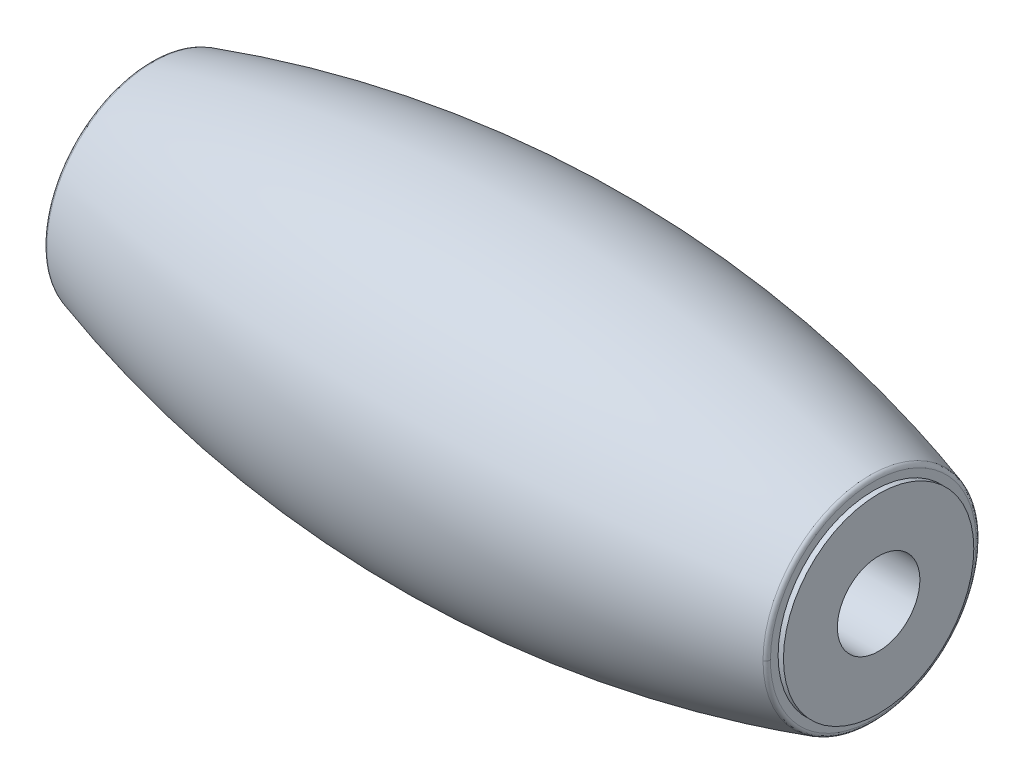
ISO-10303-21;
HEADER;
FILE_DESCRIPTION(('STEP AP214'),'2;1');
FILE_NAME('part.step','',(''),(''),'','','');
FILE_SCHEMA(('AUTOMOTIVE_DESIGN { 1 0 10303 214 1 1 1 1 }'));
ENDSEC;
DATA;
#1=APPLICATION_CONTEXT('core data for automotive mechanical design processes');
#2=APPLICATION_PROTOCOL_DEFINITION('international standard','automotive_design',2000,#1);
#3=PRODUCT_CONTEXT('',#1,'mechanical');
#4=PRODUCT('Part','Part','',(#3));
#5=PRODUCT_RELATED_PRODUCT_CATEGORY('part','',(#4));
#6=PRODUCT_DEFINITION_FORMATION('','',#4);
#7=PRODUCT_DEFINITION_CONTEXT('part definition',#1,'design');
#8=PRODUCT_DEFINITION('design','',#6,#7);
#9=PRODUCT_DEFINITION_SHAPE('','',#8);
#10=(LENGTH_UNIT() NAMED_UNIT(*) SI_UNIT(.MILLI.,.METRE.));
#11=(NAMED_UNIT(*) PLANE_ANGLE_UNIT() SI_UNIT($,.RADIAN.));
#12=(NAMED_UNIT(*) SI_UNIT($,.STERADIAN.) SOLID_ANGLE_UNIT());
#13=UNCERTAINTY_MEASURE_WITH_UNIT(LENGTH_MEASURE(1.E-05),#10,'distance_accuracy_value','');
#14=(GEOMETRIC_REPRESENTATION_CONTEXT(3) GLOBAL_UNCERTAINTY_ASSIGNED_CONTEXT((#13)) GLOBAL_UNIT_ASSIGNED_CONTEXT((#10,
#11,#12)) REPRESENTATION_CONTEXT('',''));
#15=CARTESIAN_POINT('',(0.,0.,0.));
#16=DIRECTION('',(0.,0.,1.));
#17=DIRECTION('',(1.,0.,0.));
#18=AXIS2_PLACEMENT_3D('',#15,#16,#17);
#19=CARTESIAN_POINT('',(14.097,0.,0.));
#20=DIRECTION('',(1.,0.,0.));
#21=DIRECTION('',(0.,0.,-1.));
#22=AXIS2_PLACEMENT_3D('',#19,#20,#21);
#23=CYLINDRICAL_SURFACE('',#22,3.7592);
#24=CARTESIAN_POINT('',(14.478,0.,0.));
#25=DIRECTION('',(1.,0.,0.));
#26=DIRECTION('',(0.,0.,-1.));
#27=AXIS2_PLACEMENT_3D('',#24,#25,#26);
#28=CIRCLE('',#27,3.7592);
#29=CARTESIAN_POINT('',(14.478,0.,-3.7592));
#30=VERTEX_POINT('',#29);
#31=EDGE_CURVE('P0_E19',#30,#30,#28,.T.);
#32=ORIENTED_EDGE('',*,*,#31,.F.);
#33=EDGE_LOOP('',(#32));
#34=FACE_BOUND('',#33,.T.);
#35=CARTESIAN_POINT('',(14.097,0.,0.));
#36=DIRECTION('',(1.,0.,0.));
#37=DIRECTION('',(0.,0.,-1.));
#38=AXIS2_PLACEMENT_3D('',#35,#36,#37);
#39=CIRCLE('',#38,3.7592);
#40=CARTESIAN_POINT('',(14.097,0.,-3.7592));
#41=VERTEX_POINT('',#40);
#42=EDGE_CURVE('P0_E41',#41,#41,#39,.T.);
#43=ORIENTED_EDGE('',*,*,#42,.T.);
#44=EDGE_LOOP('',(#43));
#45=FACE_BOUND('',#44,.T.);
#46=ADVANCED_FACE('P0_F15',(#34,#45),#23,.T.);
#47=CARTESIAN_POINT('',(14.478,-3.8043104,3.8043104));
#48=DIRECTION('',(1.,0.,0.));
#49=DIRECTION('',(0.,0.,-1.));
#50=AXIS2_PLACEMENT_3D('',#47,#48,#49);
#51=PLANE('',#50);
#52=CARTESIAN_POINT('',(14.478,0.,0.));
#53=DIRECTION('',(-1.,0.,0.));
#54=DIRECTION('',(0.,-1.,0.));
#55=AXIS2_PLACEMENT_3D('',#52,#53,#54);
#56=CIRCLE('',#55,1.628775);
#57=CARTESIAN_POINT('',(14.478,-1.628775,0.));
#58=VERTEX_POINT('',#57);
#59=EDGE_CURVE('P0_E39',#58,#58,#56,.F.);
#60=ORIENTED_EDGE('',*,*,#59,.F.);
#61=EDGE_LOOP('',(#60));
#62=FACE_BOUND('',#61,.T.);
#63=ORIENTED_EDGE('',*,*,#31,.T.);
#64=EDGE_LOOP('',(#63));
#65=FACE_BOUND('',#64,.T.);
#66=ADVANCED_FACE('P0_F48',(#62,#65),#51,.T.);
#67=CARTESIAN_POINT('',(14.097,-3.8043104,3.8043104));
#68=DIRECTION('',(1.,0.,0.));
#69=DIRECTION('',(0.,0.,-1.));
#70=AXIS2_PLACEMENT_3D('',#67,#68,#69);
#71=PLANE('',#70);
#72=CARTESIAN_POINT('',(14.097,0.,0.));
#73=DIRECTION('',(-1.,0.,0.));
#74=DIRECTION('',(0.,0.,1.));
#75=AXIS2_PLACEMENT_3D('',#72,#73,#74);
#76=CIRCLE('',#75,3.);
#77=CARTESIAN_POINT('',(14.097,0.,3.));
#78=VERTEX_POINT('',#77);
#79=EDGE_CURVE('P0_E36',#78,#78,#76,.F.);
#80=ORIENTED_EDGE('',*,*,#79,.T.);
#81=EDGE_LOOP('',(#80));
#82=FACE_BOUND('',#81,.T.);
#83=ORIENTED_EDGE('',*,*,#42,.F.);
#84=EDGE_LOOP('',(#83));
#85=FACE_BOUND('',#84,.T.);
#86=ADVANCED_FACE('P0_F56',(#82,#85),#71,.F.);
#87=CARTESIAN_POINT('',(14.478,0.,0.));
#88=DIRECTION('',(-1.,0.,0.));
#89=DIRECTION('',(0.,-1.,0.));
#90=AXIS2_PLACEMENT_3D('',#87,#88,#89);
#91=CYLINDRICAL_SURFACE('',#90,1.628775);
#92=CARTESIAN_POINT('',(-14.478,0.,0.));
#93=DIRECTION('',(-1.,0.,0.));
#94=DIRECTION('',(0.,-1.,0.));
#95=AXIS2_PLACEMENT_3D('',#92,#93,#94);
#96=CIRCLE('',#95,1.628775);
#97=CARTESIAN_POINT('',(-14.478,-1.62877500000002,0.));
#98=VERTEX_POINT('',#97);
#99=EDGE_CURVE('P0_E33',#98,#98,#96,.T.);
#100=ORIENTED_EDGE('',*,*,#99,.T.);
#101=EDGE_LOOP('',(#100));
#102=FACE_BOUND('',#101,.T.);
#103=ORIENTED_EDGE('',*,*,#59,.T.);
#104=EDGE_LOOP('',(#103));
#105=FACE_BOUND('',#104,.T.);
#106=ADVANCED_FACE('P0_F73',(#102,#105),#91,.F.);
#107=CARTESIAN_POINT('',(14.097,0.,0.));
#108=DIRECTION('',(-1.,0.,0.));
#109=DIRECTION('',(0.,0.,1.));
#110=AXIS2_PLACEMENT_3D('',#107,#108,#109);
#111=CYLINDRICAL_SURFACE('',#110,3.);
#112=CARTESIAN_POINT('',(-14.097,0.,0.));
#113=DIRECTION('',(-1.,0.,0.));
#114=DIRECTION('',(0.,0.,1.));
#115=AXIS2_PLACEMENT_3D('',#112,#113,#114);
#116=CIRCLE('',#115,3.);
#117=CARTESIAN_POINT('',(-14.097,0.,3.));
#118=VERTEX_POINT('',#117);
#119=EDGE_CURVE('P0_E28',#118,#118,#116,.F.);
#120=ORIENTED_EDGE('',*,*,#119,.T.);
#121=EDGE_LOOP('',(#120));
#122=FACE_BOUND('',#121,.T.);
#123=ORIENTED_EDGE('',*,*,#79,.F.);
#124=EDGE_LOOP('',(#123));
#125=FACE_BOUND('',#124,.T.);
#126=ADVANCED_FACE('P0_F71',(#122,#125),#111,.T.);
#127=CARTESIAN_POINT('',(-14.478,-3.8043104,3.8043104));
#128=DIRECTION('',(1.,0.,0.));
#129=DIRECTION('',(0.,0.,-1.));
#130=AXIS2_PLACEMENT_3D('',#127,#128,#129);
#131=PLANE('',#130);
#132=ORIENTED_EDGE('',*,*,#99,.F.);
#133=EDGE_LOOP('',(#132));
#134=FACE_BOUND('',#133,.T.);
#135=CARTESIAN_POINT('',(-14.478,0.,0.));
#136=DIRECTION('',(-1.,0.,0.));
#137=DIRECTION('',(0.,0.,1.));
#138=AXIS2_PLACEMENT_3D('',#135,#136,#137);
#139=CIRCLE('',#138,3.7592);
#140=CARTESIAN_POINT('',(-14.478,0.,3.7592));
#141=VERTEX_POINT('',#140);
#142=EDGE_CURVE('P0_E23',#141,#141,#139,.T.);
#143=ORIENTED_EDGE('',*,*,#142,.T.);
#144=EDGE_LOOP('',(#143));
#145=FACE_BOUND('',#144,.T.);
#146=ADVANCED_FACE('P0_F67',(#134,#145),#131,.F.);
#147=CARTESIAN_POINT('',(-14.097,-3.8043104,-3.8043104));
#148=DIRECTION('',(-1.,0.,0.));
#149=DIRECTION('',(0.,0.,1.));
#150=AXIS2_PLACEMENT_3D('',#147,#148,#149);
#151=PLANE('',#150);
#152=ORIENTED_EDGE('',*,*,#119,.F.);
#153=EDGE_LOOP('',(#152));
#154=FACE_BOUND('',#153,.T.);
#155=CARTESIAN_POINT('',(-14.097,0.,0.));
#156=DIRECTION('',(-1.,0.,0.));
#157=DIRECTION('',(0.,0.,1.));
#158=AXIS2_PLACEMENT_3D('',#155,#156,#157);
#159=CIRCLE('',#158,3.7592);
#160=CARTESIAN_POINT('',(-14.097,0.,3.7592));
#161=VERTEX_POINT('',#160);
#162=EDGE_CURVE('P0_E10',#161,#161,#159,.F.);
#163=ORIENTED_EDGE('',*,*,#162,.T.);
#164=EDGE_LOOP('',(#163));
#165=FACE_BOUND('',#164,.T.);
#166=ADVANCED_FACE('P0_F17',(#154,#165),#151,.F.);
#167=CARTESIAN_POINT('',(-14.097,0.,0.));
#168=DIRECTION('',(-1.,0.,0.));
#169=DIRECTION('',(0.,0.,1.));
#170=AXIS2_PLACEMENT_3D('',#167,#168,#169);
#171=CYLINDRICAL_SURFACE('',#170,3.7592);
#172=ORIENTED_EDGE('',*,*,#162,.F.);
#173=EDGE_LOOP('',(#172));
#174=FACE_BOUND('',#173,.T.);
#175=ORIENTED_EDGE('',*,*,#142,.F.);
#176=EDGE_LOOP('',(#175));
#177=FACE_BOUND('',#176,.T.);
#178=ADVANCED_FACE('P0_F60',(#174,#177),#171,.T.);
#179=CLOSED_SHELL('',(#46,#66,#86,#106,#126,#146,#166,#178));
#180=MANIFOLD_SOLID_BREP('P0_B1',#179);
#181=CARTESIAN_POINT('',(0.,0.,0.));
#182=DIRECTION('',(-1.,0.,0.));
#183=DIRECTION('',(0.,0.,1.));
#184=AXIS2_PLACEMENT_3D('',#181,#182,#183);
#185=DEGENERATE_TOROIDAL_SURFACE('',#184,42.1680420999168,48.5061716777743,.F.);
#186=CARTESIAN_POINT('',(-14.142494218031,0.,0.));
#187=DIRECTION('',(-1.,0.,0.));
#188=DIRECTION('',(0.,-1.,0.));
#189=AXIS2_PLACEMENT_3D('',#186,#187,#188);
#190=CIRCLE('',#189,4.23064913259481);
#191=CARTESIAN_POINT('',(-14.1424942180233,0.,-4.23064913269611));
#192=VERTEX_POINT('',#191);
#193=CARTESIAN_POINT('',(-14.1424942180233,0.,4.23064913269611));
#194=VERTEX_POINT('',#193);
#195=EDGE_CURVE('P1_E83',#192,#194,#190,.T.);
#196=ORIENTED_EDGE('',*,*,#195,.F.);
#197=CARTESIAN_POINT('',(-14.142494218031,0.,0.));
#198=DIRECTION('',(-1.,0.,0.));
#199=DIRECTION('',(0.,-1.,0.));
#200=AXIS2_PLACEMENT_3D('',#197,#198,#199);
#201=CIRCLE('',#200,4.23064913259481);
#202=EDGE_CURVE('P1_E55',#194,#192,#201,.T.);
#203=ORIENTED_EDGE('',*,*,#202,.F.);
#204=EDGE_LOOP('',(#196,#203));
#205=FACE_BOUND('',#204,.T.);
#206=CARTESIAN_POINT('',(14.142494218031,0.,0.));
#207=DIRECTION('',(1.,0.,0.));
#208=DIRECTION('',(0.,1.,0.));
#209=AXIS2_PLACEMENT_3D('',#206,#207,#208);
#210=CIRCLE('',#209,4.23064913259481);
#211=CARTESIAN_POINT('',(14.1424942180586,0.,-4.23064913268534));
#212=VERTEX_POINT('',#211);
#213=CARTESIAN_POINT('',(14.1424942180233,0.,4.23064913269611));
#214=VERTEX_POINT('',#213);
#215=EDGE_CURVE('P1_E71',#212,#214,#210,.T.);
#216=ORIENTED_EDGE('',*,*,#215,.F.);
#217=CARTESIAN_POINT('',(14.142494218031,0.,0.));
#218=DIRECTION('',(1.,0.,0.));
#219=DIRECTION('',(0.,1.,0.));
#220=AXIS2_PLACEMENT_3D('',#217,#218,#219);
#221=CIRCLE('',#220,4.23064913259481);
#222=EDGE_CURVE('P1_E61',#214,#212,#221,.T.);
#223=ORIENTED_EDGE('',*,*,#222,.F.);
#224=EDGE_LOOP('',(#216,#223));
#225=FACE_BOUND('',#224,.T.);
#226=ADVANCED_FACE('P1_F17',(#205,#225),#185,.F.);
#227=CARTESIAN_POINT('',(-14.266376392,0.,-4.044610919));
#228=CARTESIAN_POINT('',(-14.266376392,-8.089221839,-4.044610919));
#229=CARTESIAN_POINT('',(-14.266376392,-8.089221839,4.044610919));
#230=CARTESIAN_POINT('',(-14.266376392,0.,4.044610919));
#231=CARTESIAN_POINT('',(-14.275909005,0.,-4.13961908));
#232=CARTESIAN_POINT('',(-14.275909005,-8.279238159,-4.13961908));
#233=CARTESIAN_POINT('',(-14.275909005,-8.279238159,4.13961908));
#234=CARTESIAN_POINT('',(-14.275909005,0.,4.13961908));
#235=CARTESIAN_POINT('',(-14.219079702,0.,-4.216351417));
#236=CARTESIAN_POINT('',(-14.219079702,-8.432702834,-4.216351417));
#237=CARTESIAN_POINT('',(-14.219079702,-8.432702834,4.216351417));
#238=CARTESIAN_POINT('',(-14.219079702,0.,4.216351417));
#239=CARTESIAN_POINT('',(-14.12542009,0.,-4.234933621));
#240=CARTESIAN_POINT('',(-14.12542009,-8.469867243,-4.234933621));
#241=CARTESIAN_POINT('',(-14.12542009,-8.469867243,4.234933621));
#242=CARTESIAN_POINT('',(-14.12542009,0.,4.234933621));
#243=(BOUNDED_SURFACE() B_SPLINE_SURFACE(3,3,((#227,#228,#229,#230),(#231,#232,#233,#234),(#235,
#236,#237,#238),(#239,#240,#241,#242)),.UNSPECIFIED.,.F.,.F.,
.F.) B_SPLINE_SURFACE_WITH_KNOTS((4,4),(4,4),(0.,1.),(0.,1.),
.UNSPECIFIED.) GEOMETRIC_REPRESENTATION_ITEM() RATIONAL_B_SPLINE_SURFACE(((1.,0.333333333333333,
0.333333333333333,1.),(0.826781811919909,0.275593937306636,0.275593937306636,0.826781811919909),
(0.826781811919909,0.275593937306636,0.275593937306636,0.826781811919909),(1.,0.333333333333333,
0.333333333333333,1.))) REPRESENTATION_ITEM('') SURFACE());
#244=CARTESIAN_POINT('',(-14.266376392,0.,4.044610919));
#245=CARTESIAN_POINT('',(-14.275909005,0.,4.13961908));
#246=CARTESIAN_POINT('',(-14.219079702,0.,4.216351417));
#247=CARTESIAN_POINT('',(-14.12542009,0.,4.234933621));
#248=(BOUNDED_CURVE() B_SPLINE_CURVE(3,(#244,#245,#246,#247),.UNSPECIFIED.,.F.,
.F.) B_SPLINE_CURVE_WITH_KNOTS((4,4),(0.,1.),
.UNSPECIFIED.) CURVE() GEOMETRIC_REPRESENTATION_ITEM() RATIONAL_B_SPLINE_CURVE((1.,
0.826781811919909,0.826781811919909,1.)) REPRESENTATION_ITEM(''));
#249=CARTESIAN_POINT('',(-14.2672561997799,0.,4.0621924038768));
#250=VERTEX_POINT('',#249);
#251=EDGE_CURVE('P1_E68',#250,#194,#248,.T.);
#252=CARTESIAN_POINT('',(-14.2672561996332,0.,4.06219240432323));
#253=CARTESIAN_POINT('',(-14.2672561996332,-8.12438480931119,4.06219240432323));
#254=CARTESIAN_POINT('',(-14.2672561996332,-8.12438480931119,-4.06219240432323));
#255=CARTESIAN_POINT('',(-14.2672561996332,0.,-4.06219240432323));
#256=(BOUNDED_CURVE() B_SPLINE_CURVE(3,(#252,#253,#254,#255),.UNSPECIFIED.,.F.,
.F.) B_SPLINE_CURVE_WITH_KNOTS((4,4),(0.,1.),
.UNSPECIFIED.) CURVE() GEOMETRIC_REPRESENTATION_ITEM() RATIONAL_B_SPLINE_CURVE((0.964830492883424,
0.321610164294474,0.321610164294474,0.964830492883424)) REPRESENTATION_ITEM(''));
#257=CARTESIAN_POINT('',(-14.2672561997799,0.,-4.0621924038768));
#258=VERTEX_POINT('',#257);
#259=EDGE_CURVE('P1_E76',#250,#258,#256,.T.);
#260=CARTESIAN_POINT('',(-14.266376392,0.,-4.044610919));
#261=CARTESIAN_POINT('',(-14.275909005,0.,-4.13961908));
#262=CARTESIAN_POINT('',(-14.219079702,0.,-4.216351417));
#263=CARTESIAN_POINT('',(-14.12542009,0.,-4.234933621));
#264=(BOUNDED_CURVE() B_SPLINE_CURVE(3,(#260,#261,#262,#263),.UNSPECIFIED.,.F.,
.F.) B_SPLINE_CURVE_WITH_KNOTS((4,4),(0.,1.),
.UNSPECIFIED.) CURVE() GEOMETRIC_REPRESENTATION_ITEM() RATIONAL_B_SPLINE_CURVE((1.,
0.826781811919909,0.826781811919909,1.)) REPRESENTATION_ITEM(''));
#265=EDGE_CURVE('P1_E88',#192,#258,#264,.F.);
#266=ORIENTED_EDGE('',*,*,#251,.F.);
#267=ORIENTED_EDGE('',*,*,#259,.T.);
#268=ORIENTED_EDGE('',*,*,#265,.F.);
#269=ORIENTED_EDGE('',*,*,#195,.T.);
#270=EDGE_LOOP('',(#266,#267,#268,#269));
#271=FACE_BOUND('',#270,.T.);
#272=ADVANCED_FACE('P1_F177',(#271),#243,.T.);
#273=CARTESIAN_POINT('',(-14.266376392,0.,4.044610919));
#274=CARTESIAN_POINT('',(-14.266376392,8.089221839,4.044610919));
#275=CARTESIAN_POINT('',(-14.266376392,8.089221839,-4.044610919));
#276=CARTESIAN_POINT('',(-14.266376392,0.,-4.044610919));
#277=CARTESIAN_POINT('',(-14.275909005,0.,4.13961908));
#278=CARTESIAN_POINT('',(-14.275909005,8.279238159,4.13961908));
#279=CARTESIAN_POINT('',(-14.275909005,8.279238159,-4.13961908));
#280=CARTESIAN_POINT('',(-14.275909005,0.,-4.13961908));
#281=CARTESIAN_POINT('',(-14.219079702,0.,4.216351417));
#282=CARTESIAN_POINT('',(-14.219079702,8.432702834,4.216351417));
#283=CARTESIAN_POINT('',(-14.219079702,8.432702834,-4.216351417));
#284=CARTESIAN_POINT('',(-14.219079702,0.,-4.216351417));
#285=CARTESIAN_POINT('',(-14.12542009,0.,4.234933621));
#286=CARTESIAN_POINT('',(-14.12542009,8.469867243,4.234933621));
#287=CARTESIAN_POINT('',(-14.12542009,8.469867243,-4.234933621));
#288=CARTESIAN_POINT('',(-14.12542009,0.,-4.234933621));
#289=(BOUNDED_SURFACE() B_SPLINE_SURFACE(3,3,((#273,#274,#275,#276),(#277,#278,#279,#280),(#281,
#282,#283,#284),(#285,#286,#287,#288)),.UNSPECIFIED.,.F.,.F.,
.F.) B_SPLINE_SURFACE_WITH_KNOTS((4,4),(4,4),(0.,1.),(0.,1.),
.UNSPECIFIED.) GEOMETRIC_REPRESENTATION_ITEM() RATIONAL_B_SPLINE_SURFACE(((1.,0.333333333333333,
0.333333333333333,1.),(0.826781811919909,0.275593937306636,0.275593937306636,0.826781811919909),
(0.826781811919909,0.275593937306636,0.275593937306636,0.826781811919909),(1.,0.333333333333333,
0.333333333333333,1.))) REPRESENTATION_ITEM('') SURFACE());
#290=CARTESIAN_POINT('',(-14.2672561996332,0.,-4.06219240432323));
#291=CARTESIAN_POINT('',(-14.2672561996332,8.12438480931119,-4.06219240432323));
#292=CARTESIAN_POINT('',(-14.2672561996332,8.12438480931119,4.06219240432323));
#293=CARTESIAN_POINT('',(-14.2672561996332,0.,4.06219240432323));
#294=(BOUNDED_CURVE() B_SPLINE_CURVE(3,(#290,#291,#292,#293),.UNSPECIFIED.,.F.,
.F.) B_SPLINE_CURVE_WITH_KNOTS((4,4),(0.,1.),
.UNSPECIFIED.) CURVE() GEOMETRIC_REPRESENTATION_ITEM() RATIONAL_B_SPLINE_CURVE((0.964830492883426,
0.321610164294475,0.321610164294475,0.964830492883426)) REPRESENTATION_ITEM(''));
#295=EDGE_CURVE('P1_E140',#258,#250,#294,.T.);
#296=ORIENTED_EDGE('',*,*,#295,.T.);
#297=ORIENTED_EDGE('',*,*,#251,.T.);
#298=ORIENTED_EDGE('',*,*,#202,.T.);
#299=ORIENTED_EDGE('',*,*,#265,.T.);
#300=EDGE_LOOP('',(#296,#297,#298,#299));
#301=FACE_BOUND('',#300,.T.);
#302=ADVANCED_FACE('P1_F163',(#301),#289,.T.);
#303=CARTESIAN_POINT('',(14.12542009,0.,-4.234933621));
#304=CARTESIAN_POINT('',(14.12542009,-8.469867243,-4.234933621));
#305=CARTESIAN_POINT('',(14.12542009,-8.469867243,4.234933621));
#306=CARTESIAN_POINT('',(14.12542009,0.,4.234933621));
#307=CARTESIAN_POINT('',(14.219079702,0.,-4.216351417));
#308=CARTESIAN_POINT('',(14.219079702,-8.432702834,-4.216351417));
#309=CARTESIAN_POINT('',(14.219079702,-8.432702834,4.216351417));
#310=CARTESIAN_POINT('',(14.219079702,0.,4.216351417));
#311=CARTESIAN_POINT('',(14.275909005,0.,-4.13961908));
#312=CARTESIAN_POINT('',(14.275909005,-8.279238159,-4.13961908));
#313=CARTESIAN_POINT('',(14.275909005,-8.279238159,4.13961908));
#314=CARTESIAN_POINT('',(14.275909005,0.,4.13961908));
#315=CARTESIAN_POINT('',(14.266376392,0.,-4.044610919));
#316=CARTESIAN_POINT('',(14.266376392,-8.089221839,-4.044610919));
#317=CARTESIAN_POINT('',(14.266376392,-8.089221839,4.044610919));
#318=CARTESIAN_POINT('',(14.266376392,0.,4.044610919));
#319=(BOUNDED_SURFACE() B_SPLINE_SURFACE(3,3,((#303,#304,#305,#306),(#307,#308,#309,#310),(#311,
#312,#313,#314),(#315,#316,#317,#318)),.UNSPECIFIED.,.F.,.F.,
.F.) B_SPLINE_SURFACE_WITH_KNOTS((4,4),(4,4),(0.,1.),(0.,1.),
.UNSPECIFIED.) GEOMETRIC_REPRESENTATION_ITEM() RATIONAL_B_SPLINE_SURFACE(((1.,0.333333333333333,
0.333333333333333,1.),(0.826781811919911,0.275593937306637,0.275593937306637,0.826781811919911),
(0.826781811919911,0.275593937306637,0.275593937306637,0.826781811919911),(1.,0.333333333333333,
0.333333333333333,1.))) REPRESENTATION_ITEM('') SURFACE());
#320=CARTESIAN_POINT('',(14.12542009,0.,4.234933621));
#321=CARTESIAN_POINT('',(14.219079702,0.,4.216351417));
#322=CARTESIAN_POINT('',(14.275909005,0.,4.13961908));
#323=CARTESIAN_POINT('',(14.266376392,0.,4.044610919));
#324=(BOUNDED_CURVE() B_SPLINE_CURVE(3,(#320,#321,#322,#323),.UNSPECIFIED.,.F.,
.F.) B_SPLINE_CURVE_WITH_KNOTS((4,4),(0.,1.),
.UNSPECIFIED.) CURVE() GEOMETRIC_REPRESENTATION_ITEM() RATIONAL_B_SPLINE_CURVE((1.,
0.826781811919911,0.826781811919911,1.)) REPRESENTATION_ITEM(''));
#325=CARTESIAN_POINT('',(14.2672561997799,0.,4.0621924038768));
#326=VERTEX_POINT('',#325);
#327=EDGE_CURVE('P1_E35',#214,#326,#324,.T.);
#328=CARTESIAN_POINT('',(14.12542009,0.,-4.234933621));
#329=CARTESIAN_POINT('',(14.219079702,0.,-4.216351417));
#330=CARTESIAN_POINT('',(14.275909005,0.,-4.13961908));
#331=CARTESIAN_POINT('',(14.266376392,0.,-4.044610919));
#332=(BOUNDED_CURVE() B_SPLINE_CURVE(3,(#328,#329,#330,#331),.UNSPECIFIED.,.F.,
.F.) B_SPLINE_CURVE_WITH_KNOTS((4,4),(0.,1.),
.UNSPECIFIED.) CURVE() GEOMETRIC_REPRESENTATION_ITEM() RATIONAL_B_SPLINE_CURVE((1.,
0.826781811919911,0.826781811919911,1.)) REPRESENTATION_ITEM(''));
#333=CARTESIAN_POINT('',(14.2672561997799,0.,-4.0621924038768));
#334=VERTEX_POINT('',#333);
#335=EDGE_CURVE('P1_E65',#334,#212,#332,.F.);
#336=CARTESIAN_POINT('',(14.2672561996332,0.,-4.06219240432323));
#337=CARTESIAN_POINT('',(14.2672561996332,-8.12438480931119,-4.06219240432323));
#338=CARTESIAN_POINT('',(14.2672561996332,-8.12438480931119,4.06219240432323));
#339=CARTESIAN_POINT('',(14.2672561996332,0.,4.06219240432323));
#340=(BOUNDED_CURVE() B_SPLINE_CURVE(3,(#336,#337,#338,#339),.UNSPECIFIED.,.F.,
.F.) B_SPLINE_CURVE_WITH_KNOTS((4,4),(0.,1.),
.UNSPECIFIED.) CURVE() GEOMETRIC_REPRESENTATION_ITEM() RATIONAL_B_SPLINE_CURVE((0.964830492883426,
0.321610164294475,0.321610164294475,0.964830492883426)) REPRESENTATION_ITEM(''));
#341=EDGE_CURVE('P1_E122',#334,#326,#340,.T.);
#342=ORIENTED_EDGE('',*,*,#327,.F.);
#343=ORIENTED_EDGE('',*,*,#222,.T.);
#344=ORIENTED_EDGE('',*,*,#335,.F.);
#345=ORIENTED_EDGE('',*,*,#341,.T.);
#346=EDGE_LOOP('',(#342,#343,#344,#345));
#347=FACE_BOUND('',#346,.T.);
#348=ADVANCED_FACE('P1_F63',(#347),#319,.T.);
#349=CARTESIAN_POINT('',(14.12542009,0.,4.234933621));
#350=CARTESIAN_POINT('',(14.12542009,8.469867243,4.234933621));
#351=CARTESIAN_POINT('',(14.12542009,8.469867243,-4.234933621));
#352=CARTESIAN_POINT('',(14.12542009,0.,-4.234933621));
#353=CARTESIAN_POINT('',(14.219079702,0.,4.216351417));
#354=CARTESIAN_POINT('',(14.219079702,8.432702834,4.216351417));
#355=CARTESIAN_POINT('',(14.219079702,8.432702834,-4.216351417));
#356=CARTESIAN_POINT('',(14.219079702,0.,-4.216351417));
#357=CARTESIAN_POINT('',(14.275909005,0.,4.13961908));
#358=CARTESIAN_POINT('',(14.275909005,8.279238159,4.13961908));
#359=CARTESIAN_POINT('',(14.275909005,8.279238159,-4.13961908));
#360=CARTESIAN_POINT('',(14.275909005,0.,-4.13961908));
#361=CARTESIAN_POINT('',(14.266376392,0.,4.044610919));
#362=CARTESIAN_POINT('',(14.266376392,8.089221839,4.044610919));
#363=CARTESIAN_POINT('',(14.266376392,8.089221839,-4.044610919));
#364=CARTESIAN_POINT('',(14.266376392,0.,-4.044610919));
#365=(BOUNDED_SURFACE() B_SPLINE_SURFACE(3,3,((#349,#350,#351,#352),(#353,#354,#355,#356),(#357,
#358,#359,#360),(#361,#362,#363,#364)),.UNSPECIFIED.,.F.,.F.,
.F.) B_SPLINE_SURFACE_WITH_KNOTS((4,4),(4,4),(0.,1.),(0.,1.),
.UNSPECIFIED.) GEOMETRIC_REPRESENTATION_ITEM() RATIONAL_B_SPLINE_SURFACE(((1.,0.333333333333333,
0.333333333333333,1.),(0.826781811919911,0.275593937306637,0.275593937306637,0.826781811919911),
(0.826781811919911,0.275593937306637,0.275593937306637,0.826781811919911),(1.,0.333333333333333,
0.333333333333333,1.))) REPRESENTATION_ITEM('') SURFACE());
#366=CARTESIAN_POINT('',(14.2672561996332,0.,4.06219240432323));
#367=CARTESIAN_POINT('',(14.2672561996332,8.12438480931119,4.06219240432323));
#368=CARTESIAN_POINT('',(14.2672561996332,8.12438480931119,-4.06219240432323));
#369=CARTESIAN_POINT('',(14.2672561996332,0.,-4.06219240432323));
#370=(BOUNDED_CURVE() B_SPLINE_CURVE(3,(#366,#367,#368,#369),.UNSPECIFIED.,.F.,
.F.) B_SPLINE_CURVE_WITH_KNOTS((4,4),(0.,1.),
.UNSPECIFIED.) CURVE() GEOMETRIC_REPRESENTATION_ITEM() RATIONAL_B_SPLINE_CURVE((0.964830492883426,
0.321610164294475,0.321610164294475,0.964830492883426)) REPRESENTATION_ITEM(''));
#371=EDGE_CURVE('P1_E72',#326,#334,#370,.T.);
#372=ORIENTED_EDGE('',*,*,#215,.T.);
#373=ORIENTED_EDGE('',*,*,#327,.T.);
#374=ORIENTED_EDGE('',*,*,#371,.T.);
#375=ORIENTED_EDGE('',*,*,#335,.T.);
#376=EDGE_LOOP('',(#372,#373,#374,#375));
#377=FACE_BOUND('',#376,.T.);
#378=ADVANCED_FACE('P1_F70',(#377),#365,.T.);
#379=CARTESIAN_POINT('',(-14.2672562,-4.110938714,4.110938714));
#380=DIRECTION('',(1.,0.,0.));
#381=DIRECTION('',(0.,0.,-1.));
#382=AXIS2_PLACEMENT_3D('',#379,#380,#381);
#383=PLANE('',#382);
#384=CARTESIAN_POINT('',(-14.2672562,0.,0.));
#385=DIRECTION('',(1.,0.,0.));
#386=DIRECTION('',(0.,1.,0.));
#387=AXIS2_PLACEMENT_3D('',#384,#385,#386);
#388=CIRCLE('',#387,2.925);
#389=CARTESIAN_POINT('',(-14.2672562,2.925,0.));
#390=VERTEX_POINT('',#389);
#391=EDGE_CURVE('P1_E22',#390,#390,#388,.F.);
#392=ORIENTED_EDGE('',*,*,#391,.F.);
#393=EDGE_LOOP('',(#392));
#394=FACE_BOUND('',#393,.T.);
#395=ORIENTED_EDGE('',*,*,#259,.F.);
#396=ORIENTED_EDGE('',*,*,#295,.F.);
#397=EDGE_LOOP('',(#395,#396));
#398=FACE_BOUND('',#397,.T.);
#399=ADVANCED_FACE('P1_F100',(#394,#398),#383,.F.);
#400=CARTESIAN_POINT('',(14.2672562,-4.110938714,-4.110938714));
#401=DIRECTION('',(-1.,0.,0.));
#402=DIRECTION('',(0.,0.,1.));
#403=AXIS2_PLACEMENT_3D('',#400,#401,#402);
#404=PLANE('',#403);
#405=CARTESIAN_POINT('',(14.2672562,0.,0.));
#406=DIRECTION('',(1.,0.,0.));
#407=DIRECTION('',(0.,1.,0.));
#408=AXIS2_PLACEMENT_3D('',#405,#406,#407);
#409=CIRCLE('',#408,2.925);
#410=CARTESIAN_POINT('',(14.2672562,2.92499999999999,0.));
#411=VERTEX_POINT('',#410);
#412=EDGE_CURVE('P1_E11',#411,#411,#409,.T.);
#413=ORIENTED_EDGE('',*,*,#412,.F.);
#414=EDGE_LOOP('',(#413));
#415=FACE_BOUND('',#414,.T.);
#416=ORIENTED_EDGE('',*,*,#341,.F.);
#417=ORIENTED_EDGE('',*,*,#371,.F.);
#418=EDGE_LOOP('',(#416,#417));
#419=FACE_BOUND('',#418,.T.);
#420=ADVANCED_FACE('P1_F19',(#415,#419),#404,.F.);
#421=CARTESIAN_POINT('',(-14.2672562,0.,0.));
#422=DIRECTION('',(1.,0.,0.));
#423=DIRECTION('',(0.,1.,0.));
#424=AXIS2_PLACEMENT_3D('',#421,#422,#423);
#425=CYLINDRICAL_SURFACE('',#424,2.925);
#426=ORIENTED_EDGE('',*,*,#412,.T.);
#427=EDGE_LOOP('',(#426));
#428=FACE_BOUND('',#427,.T.);
#429=ORIENTED_EDGE('',*,*,#391,.T.);
#430=EDGE_LOOP('',(#429));
#431=FACE_BOUND('',#430,.T.);
#432=ADVANCED_FACE('P1_F226',(#428,#431),#425,.F.);
#433=CLOSED_SHELL('',(#226,#272,#302,#348,#378,#399,#420,#432));
#434=MANIFOLD_SOLID_BREP('P1_B1',#433);
#435=ADVANCED_BREP_SHAPE_REPRESENTATION('',(#18,#180,#434),#14);
#436=SHAPE_DEFINITION_REPRESENTATION(#9,#435);
ENDSEC;
END-ISO-10303-21;
